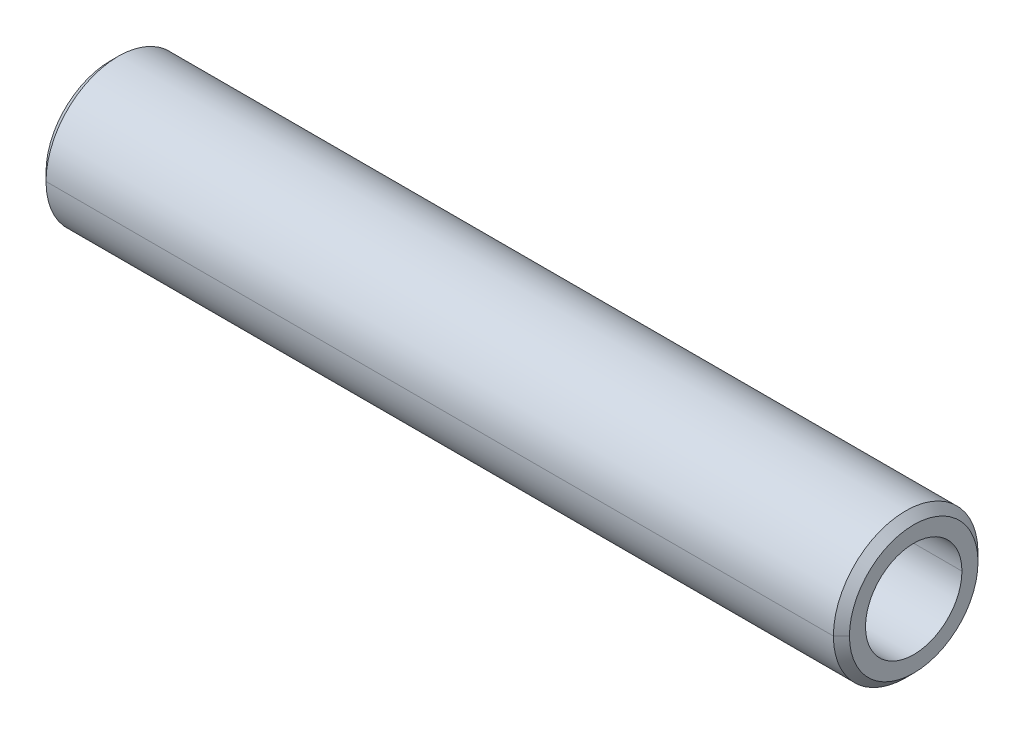
ISO-10303-21;
HEADER;
FILE_DESCRIPTION(('STEP AP214'),'2;1');
FILE_NAME('part.step','',(''),(''),'','','');
FILE_SCHEMA(('AUTOMOTIVE_DESIGN { 1 0 10303 214 1 1 1 1 }'));
ENDSEC;
DATA;
#1=APPLICATION_CONTEXT('core data for automotive mechanical design processes');
#2=APPLICATION_PROTOCOL_DEFINITION('international standard','automotive_design',2000,#1);
#3=PRODUCT_CONTEXT('',#1,'mechanical');
#4=PRODUCT('Part','Part','',(#3));
#5=PRODUCT_RELATED_PRODUCT_CATEGORY('part','',(#4));
#6=PRODUCT_DEFINITION_FORMATION('','',#4);
#7=PRODUCT_DEFINITION_CONTEXT('part definition',#1,'design');
#8=PRODUCT_DEFINITION('design','',#6,#7);
#9=PRODUCT_DEFINITION_SHAPE('','',#8);
#10=(LENGTH_UNIT() NAMED_UNIT(*) SI_UNIT(.MILLI.,.METRE.));
#11=(NAMED_UNIT(*) PLANE_ANGLE_UNIT() SI_UNIT($,.RADIAN.));
#12=(NAMED_UNIT(*) SI_UNIT($,.STERADIAN.) SOLID_ANGLE_UNIT());
#13=UNCERTAINTY_MEASURE_WITH_UNIT(LENGTH_MEASURE(1.E-05),#10,'distance_accuracy_value','');
#14=(GEOMETRIC_REPRESENTATION_CONTEXT(3) GLOBAL_UNCERTAINTY_ASSIGNED_CONTEXT((#13)) GLOBAL_UNIT_ASSIGNED_CONTEXT((#10,
#11,#12)) REPRESENTATION_CONTEXT('',''));
#15=CARTESIAN_POINT('',(0.,0.,0.));
#16=DIRECTION('',(0.,0.,1.));
#17=DIRECTION('',(1.,0.,0.));
#18=AXIS2_PLACEMENT_3D('',#15,#16,#17);
#19=CARTESIAN_POINT('',(0.,4.,0.));
#20=DIRECTION('',(-1.,0.,0.));
#21=DIRECTION('',(0.,0.,1.));
#22=AXIS2_PLACEMENT_3D('',#19,#20,#21);
#23=PLANE('',#22);
#24=CARTESIAN_POINT('',(0.,0.,0.));
#25=DIRECTION('',(1.,0.,0.));
#26=DIRECTION('',(0.,0.,-1.));
#27=AXIS2_PLACEMENT_3D('',#24,#25,#26);
#28=CIRCLE('',#27,3.);
#29=CARTESIAN_POINT('',(0.,0.,-3.));
#30=VERTEX_POINT('',#29);
#31=CARTESIAN_POINT('',(0.,0.,3.));
#32=VERTEX_POINT('',#31);
#33=EDGE_CURVE('E10',#30,#32,#28,.T.);
#34=ORIENTED_EDGE('',*,*,#33,.T.);
#35=CARTESIAN_POINT('',(0.,0.,0.));
#36=DIRECTION('',(1.,0.,0.));
#37=DIRECTION('',(0.,0.,-1.));
#38=AXIS2_PLACEMENT_3D('',#35,#36,#37);
#39=CIRCLE('',#38,3.);
#40=EDGE_CURVE('E24',#32,#30,#39,.T.);
#41=ORIENTED_EDGE('',*,*,#40,.T.);
#42=EDGE_LOOP('',(#34,#41));
#43=FACE_BOUND('',#42,.T.);
#44=CARTESIAN_POINT('',(0.,0.,0.));
#45=DIRECTION('',(1.,0.,0.));
#46=DIRECTION('',(0.,0.,-1.));
#47=AXIS2_PLACEMENT_3D('',#44,#45,#46);
#48=CIRCLE('',#47,4.);
#49=CARTESIAN_POINT('',(0.,0.,-4.));
#50=VERTEX_POINT('',#49);
#51=CARTESIAN_POINT('',(1.275812788748E-12,0.,3.99999999999872));
#52=VERTEX_POINT('',#51);
#53=EDGE_CURVE('E277',#50,#52,#48,.T.);
#54=ORIENTED_EDGE('',*,*,#53,.F.);
#55=CARTESIAN_POINT('',(0.,0.,0.));
#56=DIRECTION('',(1.,0.,0.));
#57=DIRECTION('',(0.,0.,-1.));
#58=AXIS2_PLACEMENT_3D('',#55,#56,#57);
#59=CIRCLE('',#58,4.);
#60=EDGE_CURVE('E275',#52,#50,#59,.T.);
#61=ORIENTED_EDGE('',*,*,#60,.F.);
#62=EDGE_LOOP('',(#54,#61));
#63=FACE_BOUND('',#62,.T.);
#64=ADVANCED_FACE('F16',(#43,#63),#23,.T.);
#65=CARTESIAN_POINT('',(0.5,0.,0.));
#66=DIRECTION('',(1.,0.,0.));
#67=DIRECTION('',(0.,1.,0.));
#68=AXIS2_PLACEMENT_3D('',#65,#66,#67);
#69=CONICAL_SURFACE('',#68,4.5,0.7853981634);
#70=ORIENTED_EDGE('',*,*,#60,.T.);
#71=CARTESIAN_POINT('',(1.27578069636369E-12,0.,-3.99999999999872));
#72=DIRECTION('',(0.707106781184743,0.,-0.707106781188352));
#73=VECTOR('',#72,1.);
#74=LINE('',#71,#73);
#75=CARTESIAN_POINT('',(0.5,0.,-4.5));
#76=VERTEX_POINT('',#75);
#77=EDGE_CURVE('E245',#50,#76,#74,.T.);
#78=ORIENTED_EDGE('',*,*,#77,.T.);
#79=CARTESIAN_POINT('',(0.5,0.,0.));
#80=DIRECTION('',(1.,0.,0.));
#81=DIRECTION('',(0.,0.,-1.));
#82=AXIS2_PLACEMENT_3D('',#79,#80,#81);
#83=CIRCLE('',#82,4.5);
#84=CARTESIAN_POINT('',(0.5,0.,4.5));
#85=VERTEX_POINT('',#84);
#86=EDGE_CURVE('E262',#85,#76,#83,.T.);
#87=ORIENTED_EDGE('',*,*,#86,.F.);
#88=CARTESIAN_POINT('',(1.27578069636369E-12,0.,3.99999999999872));
#89=DIRECTION('',(0.707106781184743,0.,0.707106781188352));
#90=VECTOR('',#89,1.);
#91=LINE('',#88,#90);
#92=EDGE_CURVE('E247',#52,#85,#91,.T.);
#93=ORIENTED_EDGE('',*,*,#92,.F.);
#94=EDGE_LOOP('',(#70,#78,#87,#93));
#95=FACE_BOUND('',#94,.T.);
#96=ADVANCED_FACE('F229',(#95),#69,.T.);
#97=CARTESIAN_POINT('',(0.5,0.,0.));
#98=DIRECTION('',(1.,0.,0.));
#99=DIRECTION('',(0.,-1.,0.));
#100=AXIS2_PLACEMENT_3D('',#97,#98,#99);
#101=CONICAL_SURFACE('',#100,4.5,0.7853981634);
#102=CARTESIAN_POINT('',(0.5,0.,0.));
#103=DIRECTION('',(1.,0.,0.));
#104=DIRECTION('',(0.,0.,-1.));
#105=AXIS2_PLACEMENT_3D('',#102,#103,#104);
#106=CIRCLE('',#105,4.5);
#107=EDGE_CURVE('E213',#76,#85,#106,.T.);
#108=ORIENTED_EDGE('',*,*,#107,.F.);
#109=ORIENTED_EDGE('',*,*,#77,.F.);
#110=ORIENTED_EDGE('',*,*,#53,.T.);
#111=ORIENTED_EDGE('',*,*,#92,.T.);
#112=EDGE_LOOP('',(#108,#109,#110,#111));
#113=FACE_BOUND('',#112,.T.);
#114=ADVANCED_FACE('F221',(#113),#101,.T.);
#115=CARTESIAN_POINT('',(50.,0.,0.));
#116=DIRECTION('',(-1.,0.,0.));
#117=DIRECTION('',(0.,-1.,0.));
#118=AXIS2_PLACEMENT_3D('',#115,#116,#117);
#119=CYLINDRICAL_SURFACE('',#118,4.5);
#120=CARTESIAN_POINT('',(49.5,0.,0.));
#121=DIRECTION('',(1.,0.,0.));
#122=DIRECTION('',(0.,0.,-1.));
#123=AXIS2_PLACEMENT_3D('',#120,#121,#122);
#124=CIRCLE('',#123,4.5);
#125=CARTESIAN_POINT('',(49.5,0.,-4.5));
#126=VERTEX_POINT('',#125);
#127=CARTESIAN_POINT('',(49.5000000000013,0.,4.50000000000128));
#128=VERTEX_POINT('',#127);
#129=EDGE_CURVE('E211',#126,#128,#124,.T.);
#130=ORIENTED_EDGE('',*,*,#129,.F.);
#131=CARTESIAN_POINT('',(49.5,0.,-4.5));
#132=DIRECTION('',(-1.,0.,0.));
#133=VECTOR('',#132,1.);
#134=LINE('',#131,#133);
#135=EDGE_CURVE('E189',#126,#76,#134,.T.);
#136=ORIENTED_EDGE('',*,*,#135,.T.);
#137=ORIENTED_EDGE('',*,*,#107,.T.);
#138=CARTESIAN_POINT('',(49.5,0.,4.5));
#139=DIRECTION('',(-1.,0.,0.));
#140=VECTOR('',#139,1.);
#141=LINE('',#138,#140);
#142=EDGE_CURVE('E201',#128,#85,#141,.T.);
#143=ORIENTED_EDGE('',*,*,#142,.F.);
#144=EDGE_LOOP('',(#130,#136,#137,#143));
#145=FACE_BOUND('',#144,.T.);
#146=ADVANCED_FACE('F168',(#145),#119,.T.);
#147=CARTESIAN_POINT('',(50.,0.,0.));
#148=DIRECTION('',(-1.,0.,0.));
#149=DIRECTION('',(0.,1.,0.));
#150=AXIS2_PLACEMENT_3D('',#147,#148,#149);
#151=CYLINDRICAL_SURFACE('',#150,4.5);
#152=ORIENTED_EDGE('',*,*,#86,.T.);
#153=ORIENTED_EDGE('',*,*,#135,.F.);
#154=CARTESIAN_POINT('',(49.5,0.,0.));
#155=DIRECTION('',(1.,0.,0.));
#156=DIRECTION('',(0.,0.,-1.));
#157=AXIS2_PLACEMENT_3D('',#154,#155,#156);
#158=CIRCLE('',#157,4.5);
#159=EDGE_CURVE('E421',#128,#126,#158,.T.);
#160=ORIENTED_EDGE('',*,*,#159,.F.);
#161=ORIENTED_EDGE('',*,*,#142,.T.);
#162=EDGE_LOOP('',(#152,#153,#160,#161));
#163=FACE_BOUND('',#162,.T.);
#164=ADVANCED_FACE('F159',(#163),#151,.T.);
#165=CARTESIAN_POINT('',(50.,0.,0.));
#166=DIRECTION('',(-1.,0.,0.));
#167=DIRECTION('',(0.,1.,0.));
#168=AXIS2_PLACEMENT_3D('',#165,#166,#167);
#169=CONICAL_SURFACE('',#168,4.,0.7853981634);
#170=ORIENTED_EDGE('',*,*,#159,.T.);
#171=CARTESIAN_POINT('',(50.,0.,-4.));
#172=DIRECTION('',(-0.707106781184743,0.,-0.707106781188353));
#173=VECTOR('',#172,1.);
#174=LINE('',#171,#173);
#175=CARTESIAN_POINT('',(50.,0.,-4.));
#176=VERTEX_POINT('',#175);
#177=EDGE_CURVE('E124',#176,#126,#174,.T.);
#178=ORIENTED_EDGE('',*,*,#177,.F.);
#179=CARTESIAN_POINT('',(50.,0.,0.));
#180=DIRECTION('',(1.,0.,0.));
#181=DIRECTION('',(0.,0.,-1.));
#182=AXIS2_PLACEMENT_3D('',#179,#180,#181);
#183=CIRCLE('',#182,4.);
#184=CARTESIAN_POINT('',(50.,0.,4.));
#185=VERTEX_POINT('',#184);
#186=EDGE_CURVE('E140',#185,#176,#183,.T.);
#187=ORIENTED_EDGE('',*,*,#186,.F.);
#188=CARTESIAN_POINT('',(50.,0.,4.));
#189=DIRECTION('',(-0.707106781184743,0.,0.707106781188352));
#190=VECTOR('',#189,1.);
#191=LINE('',#188,#190);
#192=EDGE_CURVE('E84',#185,#128,#191,.T.);
#193=ORIENTED_EDGE('',*,*,#192,.T.);
#194=EDGE_LOOP('',(#170,#178,#187,#193));
#195=FACE_BOUND('',#194,.T.);
#196=ADVANCED_FACE('F107',(#195),#169,.T.);
#197=CARTESIAN_POINT('',(50.,0.,0.));
#198=DIRECTION('',(-1.,0.,0.));
#199=DIRECTION('',(0.,-1.,0.));
#200=AXIS2_PLACEMENT_3D('',#197,#198,#199);
#201=CONICAL_SURFACE('',#200,4.,0.7853981634);
#202=CARTESIAN_POINT('',(50.,0.,0.));
#203=DIRECTION('',(1.,0.,0.));
#204=DIRECTION('',(0.,0.,-1.));
#205=AXIS2_PLACEMENT_3D('',#202,#203,#204);
#206=CIRCLE('',#205,4.);
#207=EDGE_CURVE('E81',#176,#185,#206,.T.);
#208=ORIENTED_EDGE('',*,*,#207,.F.);
#209=ORIENTED_EDGE('',*,*,#177,.T.);
#210=ORIENTED_EDGE('',*,*,#129,.T.);
#211=ORIENTED_EDGE('',*,*,#192,.F.);
#212=EDGE_LOOP('',(#208,#209,#210,#211));
#213=FACE_BOUND('',#212,.T.);
#214=ADVANCED_FACE('F97',(#213),#201,.T.);
#215=CARTESIAN_POINT('',(50.,3.,0.));
#216=DIRECTION('',(1.,0.,0.));
#217=DIRECTION('',(0.,0.,-1.));
#218=AXIS2_PLACEMENT_3D('',#215,#216,#217);
#219=PLANE('',#218);
#220=ORIENTED_EDGE('',*,*,#207,.T.);
#221=ORIENTED_EDGE('',*,*,#186,.T.);
#222=EDGE_LOOP('',(#220,#221));
#223=FACE_BOUND('',#222,.T.);
#224=CARTESIAN_POINT('',(50.,0.,0.));
#225=DIRECTION('',(1.,0.,0.));
#226=DIRECTION('',(0.,0.,-1.));
#227=AXIS2_PLACEMENT_3D('',#224,#225,#226);
#228=CIRCLE('',#227,3.);
#229=CARTESIAN_POINT('',(50.,0.,-3.));
#230=VERTEX_POINT('',#229);
#231=CARTESIAN_POINT('',(50.,0.,3.));
#232=VERTEX_POINT('',#231);
#233=EDGE_CURVE('E67',#230,#232,#228,.T.);
#234=ORIENTED_EDGE('',*,*,#233,.F.);
#235=CARTESIAN_POINT('',(50.,0.,0.));
#236=DIRECTION('',(1.,0.,0.));
#237=DIRECTION('',(0.,0.,-1.));
#238=AXIS2_PLACEMENT_3D('',#235,#236,#237);
#239=CIRCLE('',#238,3.);
#240=EDGE_CURVE('E63',#232,#230,#239,.T.);
#241=ORIENTED_EDGE('',*,*,#240,.F.);
#242=EDGE_LOOP('',(#234,#241));
#243=FACE_BOUND('',#242,.T.);
#244=ADVANCED_FACE('F65',(#223,#243),#219,.T.);
#245=CARTESIAN_POINT('',(50.,0.,0.));
#246=DIRECTION('',(-1.,0.,0.));
#247=DIRECTION('',(0.,1.,0.));
#248=AXIS2_PLACEMENT_3D('',#245,#246,#247);
#249=CYLINDRICAL_SURFACE('',#248,3.);
#250=ORIENTED_EDGE('',*,*,#40,.F.);
#251=CARTESIAN_POINT('',(50.,0.,3.));
#252=DIRECTION('',(-1.,0.,0.));
#253=VECTOR('',#252,1.);
#254=LINE('',#251,#253);
#255=EDGE_CURVE('E70',#232,#32,#254,.T.);
#256=ORIENTED_EDGE('',*,*,#255,.F.);
#257=ORIENTED_EDGE('',*,*,#240,.T.);
#258=CARTESIAN_POINT('',(50.,0.,-3.));
#259=DIRECTION('',(-1.,0.,0.));
#260=VECTOR('',#259,1.);
#261=LINE('',#258,#260);
#262=EDGE_CURVE('E77',#230,#30,#261,.T.);
#263=ORIENTED_EDGE('',*,*,#262,.T.);
#264=EDGE_LOOP('',(#250,#256,#257,#263));
#265=FACE_BOUND('',#264,.T.);
#266=ADVANCED_FACE('F74',(#265),#249,.F.);
#267=CARTESIAN_POINT('',(50.,0.,0.));
#268=DIRECTION('',(-1.,0.,0.));
#269=DIRECTION('',(0.,-1.,0.));
#270=AXIS2_PLACEMENT_3D('',#267,#268,#269);
#271=CYLINDRICAL_SURFACE('',#270,3.);
#272=ORIENTED_EDGE('',*,*,#233,.T.);
#273=ORIENTED_EDGE('',*,*,#255,.T.);
#274=ORIENTED_EDGE('',*,*,#33,.F.);
#275=ORIENTED_EDGE('',*,*,#262,.F.);
#276=EDGE_LOOP('',(#272,#273,#274,#275));
#277=FACE_BOUND('',#276,.T.);
#278=ADVANCED_FACE('F79',(#277),#271,.F.);
#279=CLOSED_SHELL('',(#64,#96,#114,#146,#164,#196,#214,#244,#266,#278));
#280=MANIFOLD_SOLID_BREP('B1',#279);
#281=ADVANCED_BREP_SHAPE_REPRESENTATION('',(#18,#280),#14);
#282=SHAPE_DEFINITION_REPRESENTATION(#9,#281);
ENDSEC;
END-ISO-10303-21;
